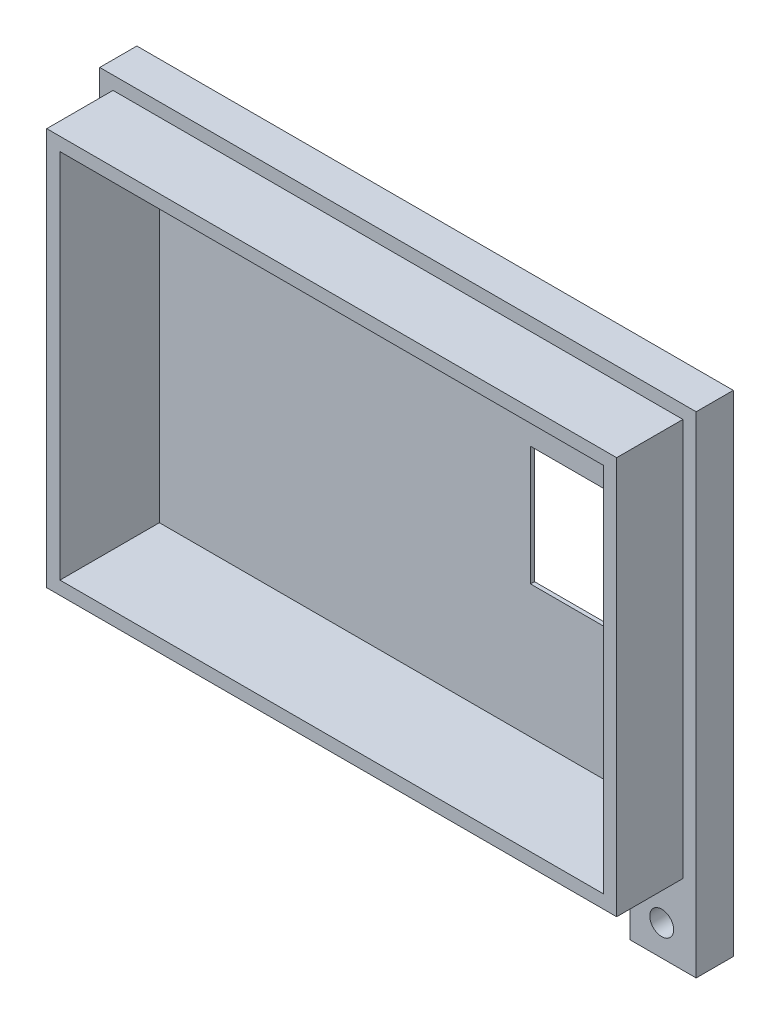
ISO-10303-21;
HEADER;
FILE_DESCRIPTION(('STEP AP214'),'2;1');
FILE_NAME('part.step','',(''),(''),'','','');
FILE_SCHEMA(('AUTOMOTIVE_DESIGN { 1 0 10303 214 1 1 1 1 }'));
ENDSEC;
DATA;
#1=APPLICATION_CONTEXT('core data for automotive mechanical design processes');
#2=APPLICATION_PROTOCOL_DEFINITION('international standard','automotive_design',2000,#1);
#3=PRODUCT_CONTEXT('',#1,'mechanical');
#4=PRODUCT('Part','Part','',(#3));
#5=PRODUCT_RELATED_PRODUCT_CATEGORY('part','',(#4));
#6=PRODUCT_DEFINITION_FORMATION('','',#4);
#7=PRODUCT_DEFINITION_CONTEXT('part definition',#1,'design');
#8=PRODUCT_DEFINITION('design','',#6,#7);
#9=PRODUCT_DEFINITION_SHAPE('','',#8);
#10=(LENGTH_UNIT() NAMED_UNIT(*) SI_UNIT(.MILLI.,.METRE.));
#11=(NAMED_UNIT(*) PLANE_ANGLE_UNIT() SI_UNIT($,.RADIAN.));
#12=(NAMED_UNIT(*) SI_UNIT($,.STERADIAN.) SOLID_ANGLE_UNIT());
#13=UNCERTAINTY_MEASURE_WITH_UNIT(LENGTH_MEASURE(1.E-05),#10,'distance_accuracy_value','');
#14=(GEOMETRIC_REPRESENTATION_CONTEXT(3) GLOBAL_UNCERTAINTY_ASSIGNED_CONTEXT((#13)) GLOBAL_UNIT_ASSIGNED_CONTEXT((#10,
#11,#12)) REPRESENTATION_CONTEXT('',''));
#15=CARTESIAN_POINT('',(0.,0.,0.));
#16=DIRECTION('',(0.,0.,1.));
#17=DIRECTION('',(1.,0.,0.));
#18=AXIS2_PLACEMENT_3D('',#15,#16,#17);
#19=CARTESIAN_POINT('',(-15.0756208599428,-20.0832626800544,7.8));
#20=DIRECTION('',(0.,1.,0.));
#21=DIRECTION('',(0.,0.,1.));
#22=AXIS2_PLACEMENT_3D('',#19,#20,#21);
#23=PLANE('',#22);
#24=DIRECTION('',(0.,0.,-1.));
#25=VECTOR('',#24,1.);
#26=CARTESIAN_POINT('',(24.9243791400572,-20.0832626800544,9.87106781186548));
#27=LINE('',#26,#25);
#28=CARTESIAN_POINT('',(24.9243791400572,-20.0832626800544,2.8));
#29=VERTEX_POINT('',#28);
#30=CARTESIAN_POINT('',(24.9243791400572,-20.0832626800544,0.));
#31=VERTEX_POINT('',#30);
#32=EDGE_CURVE('E55',#29,#31,#27,.T.);
#33=ORIENTED_EDGE('',*,*,#32,.F.);
#34=DIRECTION('',(1.,0.,0.));
#35=VECTOR('',#34,1.);
#36=CARTESIAN_POINT('',(-15.0756208599428,-20.0832626800544,2.8));
#37=LINE('',#36,#35);
#38=CARTESIAN_POINT('',(-15.0756208599428,-20.0832626800544,2.8));
#39=VERTEX_POINT('',#38);
#40=EDGE_CURVE('E171',#39,#29,#37,.T.);
#41=ORIENTED_EDGE('',*,*,#40,.F.);
#42=DIRECTION('',(0.,0.,-1.));
#43=VECTOR('',#42,1.);
#44=CARTESIAN_POINT('',(-15.0756208599428,-20.0832626800544,7.8));
#45=LINE('',#44,#43);
#46=CARTESIAN_POINT('',(-15.0756208599428,-20.0832626800544,0.));
#47=VERTEX_POINT('',#46);
#48=EDGE_CURVE('E48',#39,#47,#45,.T.);
#49=ORIENTED_EDGE('',*,*,#48,.T.);
#50=DIRECTION('',(1.,0.,0.));
#51=VECTOR('',#50,1.);
#52=CARTESIAN_POINT('',(-15.0756208599428,-20.0832626800544,0.));
#53=LINE('',#52,#51);
#54=EDGE_CURVE('E292',#47,#31,#53,.T.);
#55=ORIENTED_EDGE('',*,*,#54,.T.);
#56=EDGE_LOOP('',(#33,#41,#49,#55));
#57=FACE_BOUND('',#56,.T.);
#58=ADVANCED_FACE('F39',(#57),#23,.F.);
#59=CARTESIAN_POINT('',(0.,0.,7.8));
#60=DIRECTION('',(0.,0.,1.));
#61=DIRECTION('',(1.,0.,0.));
#62=AXIS2_PLACEMENT_3D('',#59,#60,#61);
#63=PLANE('',#62);
#64=DIRECTION('',(-1.,0.,0.));
#65=VECTOR('',#64,1.);
#66=CARTESIAN_POINT('',(27.9243791400572,9.91673731994565,7.8));
#67=LINE('',#66,#65);
#68=CARTESIAN_POINT('',(27.9243791400572,9.91673731994565,7.8));
#69=VERTEX_POINT('',#68);
#70=CARTESIAN_POINT('',(-13.0756208599428,9.91673731994565,7.8));
#71=VERTEX_POINT('',#70);
#72=EDGE_CURVE('E257',#69,#71,#67,.T.);
#73=ORIENTED_EDGE('',*,*,#72,.F.);
#74=DIRECTION('',(0.,1.,0.));
#75=VECTOR('',#74,1.);
#76=CARTESIAN_POINT('',(27.9243791400572,-18.0832626800544,7.8));
#77=LINE('',#76,#75);
#78=CARTESIAN_POINT('',(27.9243791400572,-18.0832626800544,7.8));
#79=VERTEX_POINT('',#78);
#80=EDGE_CURVE('E262',#79,#69,#77,.T.);
#81=ORIENTED_EDGE('',*,*,#80,.F.);
#82=DIRECTION('',(1.,0.,0.));
#83=VECTOR('',#82,1.);
#84=CARTESIAN_POINT('',(-13.0756208599428,-18.0832626800544,7.8));
#85=LINE('',#84,#83);
#86=CARTESIAN_POINT('',(-13.0756208599428,-18.0832626800544,7.8));
#87=VERTEX_POINT('',#86);
#88=EDGE_CURVE('E276',#87,#79,#85,.T.);
#89=ORIENTED_EDGE('',*,*,#88,.F.);
#90=DIRECTION('',(0.,-1.,0.));
#91=VECTOR('',#90,1.);
#92=CARTESIAN_POINT('',(-13.0756208599428,9.91673731994565,7.8));
#93=LINE('',#92,#91);
#94=EDGE_CURVE('E273',#71,#87,#93,.T.);
#95=ORIENTED_EDGE('',*,*,#94,.F.);
#96=EDGE_LOOP('',(#73,#81,#89,#95));
#97=FACE_BOUND('',#96,.T.);
#98=DIRECTION('',(0.,1.,0.));
#99=VECTOR('',#98,1.);
#100=CARTESIAN_POINT('',(28.9243791400572,-19.0832626800544,7.8));
#101=LINE('',#100,#99);
#102=CARTESIAN_POINT('',(28.9243791400572,-19.0832626800544,7.8));
#103=VERTEX_POINT('',#102);
#104=CARTESIAN_POINT('',(28.9243791400572,10.9167373199456,7.8));
#105=VERTEX_POINT('',#104);
#106=EDGE_CURVE('E224',#103,#105,#101,.T.);
#107=ORIENTED_EDGE('',*,*,#106,.T.);
#108=DIRECTION('',(-1.,0.,0.));
#109=VECTOR('',#108,1.);
#110=CARTESIAN_POINT('',(28.9243791400572,10.9167373199456,7.8));
#111=LINE('',#110,#109);
#112=CARTESIAN_POINT('',(-14.0756208599428,10.9167373199456,7.8));
#113=VERTEX_POINT('',#112);
#114=EDGE_CURVE('E219',#105,#113,#111,.T.);
#115=ORIENTED_EDGE('',*,*,#114,.T.);
#116=DIRECTION('',(0.,-1.,0.));
#117=VECTOR('',#116,1.);
#118=CARTESIAN_POINT('',(-14.0756208599428,10.9167373199456,7.8));
#119=LINE('',#118,#117);
#120=CARTESIAN_POINT('',(-14.0756208599428,-19.0832626800544,7.8));
#121=VERTEX_POINT('',#120);
#122=EDGE_CURVE('E236',#113,#121,#119,.T.);
#123=ORIENTED_EDGE('',*,*,#122,.T.);
#124=DIRECTION('',(1.,0.,0.));
#125=VECTOR('',#124,1.);
#126=CARTESIAN_POINT('',(-14.0756208599428,-19.0832626800544,7.8));
#127=LINE('',#126,#125);
#128=EDGE_CURVE('E239',#121,#103,#127,.T.);
#129=ORIENTED_EDGE('',*,*,#128,.T.);
#130=EDGE_LOOP('',(#107,#115,#123,#129));
#131=FACE_BOUND('',#130,.T.);
#132=ADVANCED_FACE('F374',(#97,#131),#63,.T.);
#133=CARTESIAN_POINT('',(27.9243791400572,9.91673731994565,0.3));
#134=DIRECTION('',(0.,1.,0.));
#135=DIRECTION('',(0.,0.,1.));
#136=AXIS2_PLACEMENT_3D('',#133,#134,#135);
#137=PLANE('',#136);
#138=ORIENTED_EDGE('',*,*,#72,.T.);
#139=DIRECTION('',(0.,0.,1.));
#140=VECTOR('',#139,1.);
#141=CARTESIAN_POINT('',(-13.0756208599428,9.91673731994565,0.3));
#142=LINE('',#141,#140);
#143=CARTESIAN_POINT('',(-13.0756208599428,9.91673731994565,0.3));
#144=VERTEX_POINT('',#143);
#145=EDGE_CURVE('E271',#144,#71,#142,.T.);
#146=ORIENTED_EDGE('',*,*,#145,.F.);
#147=DIRECTION('',(-1.,0.,0.));
#148=VECTOR('',#147,1.);
#149=CARTESIAN_POINT('',(27.9243791400572,9.91673731994565,0.3));
#150=LINE('',#149,#148);
#151=CARTESIAN_POINT('',(27.9243791400572,9.91673731994565,0.3));
#152=VERTEX_POINT('',#151);
#153=EDGE_CURVE('E258',#152,#144,#150,.T.);
#154=ORIENTED_EDGE('',*,*,#153,.F.);
#155=DIRECTION('',(0.,0.,1.));
#156=VECTOR('',#155,1.);
#157=CARTESIAN_POINT('',(27.9243791400572,9.91673731994565,0.3));
#158=LINE('',#157,#156);
#159=EDGE_CURVE('E281',#152,#69,#158,.T.);
#160=ORIENTED_EDGE('',*,*,#159,.T.);
#161=EDGE_LOOP('',(#138,#146,#154,#160));
#162=FACE_BOUND('',#161,.T.);
#163=ADVANCED_FACE('F379',(#162),#137,.F.);
#164=CARTESIAN_POINT('',(27.9243791400572,-18.0832626800544,0.3));
#165=DIRECTION('',(1.,0.,0.));
#166=DIRECTION('',(0.,1.,0.));
#167=AXIS2_PLACEMENT_3D('',#164,#165,#166);
#168=PLANE('',#167);
#169=ORIENTED_EDGE('',*,*,#80,.T.);
#170=ORIENTED_EDGE('',*,*,#159,.F.);
#171=DIRECTION('',(0.,1.,0.));
#172=VECTOR('',#171,1.);
#173=CARTESIAN_POINT('',(27.9243791400572,-18.0832626800544,0.3));
#174=LINE('',#173,#172);
#175=CARTESIAN_POINT('',(27.9243791400572,-18.0832626800544,0.3));
#176=VERTEX_POINT('',#175);
#177=EDGE_CURVE('E268',#176,#152,#174,.T.);
#178=ORIENTED_EDGE('',*,*,#177,.F.);
#179=DIRECTION('',(0.,0.,1.));
#180=VECTOR('',#179,1.);
#181=CARTESIAN_POINT('',(27.9243791400572,-18.0832626800544,0.3));
#182=LINE('',#181,#180);
#183=EDGE_CURVE('E284',#176,#79,#182,.T.);
#184=ORIENTED_EDGE('',*,*,#183,.T.);
#185=EDGE_LOOP('',(#169,#170,#178,#184));
#186=FACE_BOUND('',#185,.T.);
#187=ADVANCED_FACE('F388',(#186),#168,.F.);
#188=CARTESIAN_POINT('',(-13.0756208599428,-18.0832626800544,0.3));
#189=DIRECTION('',(0.,-1.,0.));
#190=DIRECTION('',(0.,0.,-1.));
#191=AXIS2_PLACEMENT_3D('',#188,#189,#190);
#192=PLANE('',#191);
#193=ORIENTED_EDGE('',*,*,#88,.T.);
#194=ORIENTED_EDGE('',*,*,#183,.F.);
#195=DIRECTION('',(1.,0.,0.));
#196=VECTOR('',#195,1.);
#197=CARTESIAN_POINT('',(-13.0756208599428,-18.0832626800544,0.3));
#198=LINE('',#197,#196);
#199=CARTESIAN_POINT('',(-13.0756208599428,-18.0832626800544,0.3));
#200=VERTEX_POINT('',#199);
#201=EDGE_CURVE('E265',#200,#176,#198,.T.);
#202=ORIENTED_EDGE('',*,*,#201,.F.);
#203=DIRECTION('',(0.,0.,1.));
#204=VECTOR('',#203,1.);
#205=CARTESIAN_POINT('',(-13.0756208599428,-18.0832626800544,0.3));
#206=LINE('',#205,#204);
#207=EDGE_CURVE('E286',#200,#87,#206,.T.);
#208=ORIENTED_EDGE('',*,*,#207,.T.);
#209=EDGE_LOOP('',(#193,#194,#202,#208));
#210=FACE_BOUND('',#209,.T.);
#211=ADVANCED_FACE('F393',(#210),#192,.F.);
#212=CARTESIAN_POINT('',(-13.0756208599428,9.91673731994565,0.3));
#213=DIRECTION('',(-1.,0.,0.));
#214=DIRECTION('',(0.,-1.,0.));
#215=AXIS2_PLACEMENT_3D('',#212,#213,#214);
#216=PLANE('',#215);
#217=ORIENTED_EDGE('',*,*,#94,.T.);
#218=ORIENTED_EDGE('',*,*,#207,.F.);
#219=DIRECTION('',(0.,-1.,0.));
#220=VECTOR('',#219,1.);
#221=CARTESIAN_POINT('',(-13.0756208599428,9.91673731994565,0.3));
#222=LINE('',#221,#220);
#223=EDGE_CURVE('E261',#144,#200,#222,.T.);
#224=ORIENTED_EDGE('',*,*,#223,.F.);
#225=ORIENTED_EDGE('',*,*,#145,.T.);
#226=EDGE_LOOP('',(#217,#218,#224,#225));
#227=FACE_BOUND('',#226,.T.);
#228=ADVANCED_FACE('F390',(#227),#216,.F.);
#229=CARTESIAN_POINT('',(0.,0.,0.3));
#230=DIRECTION('',(0.,0.,1.));
#231=DIRECTION('',(1.,0.,0.));
#232=AXIS2_PLACEMENT_3D('',#229,#230,#231);
#233=PLANE('',#232);
#234=DIRECTION('',(0.,1.,0.));
#235=VECTOR('',#234,1.);
#236=CARTESIAN_POINT('',(23.9243791400572,0.,0.3));
#237=LINE('',#236,#235);
#238=CARTESIAN_POINT('',(23.9243791400572,-8.08326268005435,0.3));
#239=VERTEX_POINT('',#238);
#240=CARTESIAN_POINT('',(23.9243791400572,0.916737319945649,0.3));
#241=VERTEX_POINT('',#240);
#242=EDGE_CURVE('E217',#239,#241,#237,.T.);
#243=ORIENTED_EDGE('',*,*,#242,.F.);
#244=DIRECTION('',(1.,0.,0.));
#245=VECTOR('',#244,1.);
#246=CARTESIAN_POINT('',(0.,-8.08326268005435,0.3));
#247=LINE('',#246,#245);
#248=CARTESIAN_POINT('',(14.9243791400572,-8.08326268005435,0.3));
#249=VERTEX_POINT('',#248);
#250=EDGE_CURVE('E206',#249,#239,#247,.T.);
#251=ORIENTED_EDGE('',*,*,#250,.F.);
#252=DIRECTION('',(0.,-1.,0.));
#253=VECTOR('',#252,1.);
#254=CARTESIAN_POINT('',(14.9243791400572,0.,0.3));
#255=LINE('',#254,#253);
#256=CARTESIAN_POINT('',(14.9243791400572,0.916737319945649,0.3));
#257=VERTEX_POINT('',#256);
#258=EDGE_CURVE('E213',#257,#249,#255,.T.);
#259=ORIENTED_EDGE('',*,*,#258,.F.);
#260=DIRECTION('',(-1.,0.,0.));
#261=VECTOR('',#260,1.);
#262=CARTESIAN_POINT('',(0.,0.916737319945649,0.3));
#263=LINE('',#262,#261);
#264=EDGE_CURVE('E215',#241,#257,#263,.T.);
#265=ORIENTED_EDGE('',*,*,#264,.F.);
#266=EDGE_LOOP('',(#243,#251,#259,#265));
#267=FACE_BOUND('',#266,.T.);
#268=ORIENTED_EDGE('',*,*,#153,.T.);
#269=ORIENTED_EDGE('',*,*,#223,.T.);
#270=ORIENTED_EDGE('',*,*,#201,.T.);
#271=ORIENTED_EDGE('',*,*,#177,.T.);
#272=EDGE_LOOP('',(#268,#269,#270,#271));
#273=FACE_BOUND('',#272,.T.);
#274=ADVANCED_FACE('F357',(#267,#273),#233,.T.);
#275=CARTESIAN_POINT('',(7.42437914005721,-4.08326268005435,2.8));
#276=DIRECTION('',(0.,0.,1.));
#277=DIRECTION('',(1.,0.,0.));
#278=AXIS2_PLACEMENT_3D('',#275,#276,#277);
#279=PLANE('',#278);
#280=CARTESIAN_POINT('',(27.3249585587116,-22.7832626800544,2.8));
#281=DIRECTION('',(0.,0.,1.));
#282=DIRECTION('',(1.,0.,0.));
#283=AXIS2_PLACEMENT_3D('',#280,#281,#282);
#284=CIRCLE('',#283,0.899999999999998);
#285=CARTESIAN_POINT('',(28.2249585587116,-22.7832626800544,2.8));
#286=VERTEX_POINT('',#285);
#287=EDGE_CURVE('E43',#286,#286,#284,.T.);
#288=ORIENTED_EDGE('',*,*,#287,.F.);
#289=EDGE_LOOP('',(#288));
#290=FACE_BOUND('',#289,.T.);
#291=DIRECTION('',(0.,1.,0.));
#292=VECTOR('',#291,1.);
#293=CARTESIAN_POINT('',(28.9243791400572,-19.0832626800544,2.8));
#294=LINE('',#293,#292);
#295=CARTESIAN_POINT('',(28.9243791400572,-19.0832626800544,2.8));
#296=VERTEX_POINT('',#295);
#297=CARTESIAN_POINT('',(28.9243791400572,10.9167373199456,2.8));
#298=VERTEX_POINT('',#297);
#299=EDGE_CURVE('E230',#296,#298,#294,.T.);
#300=ORIENTED_EDGE('',*,*,#299,.F.);
#301=DIRECTION('',(1.,0.,0.));
#302=VECTOR('',#301,1.);
#303=CARTESIAN_POINT('',(-14.0756208599428,-19.0832626800544,2.8));
#304=LINE('',#303,#302);
#305=CARTESIAN_POINT('',(-14.0756208599428,-19.0832626800544,2.8));
#306=VERTEX_POINT('',#305);
#307=EDGE_CURVE('E227',#306,#296,#304,.T.);
#308=ORIENTED_EDGE('',*,*,#307,.F.);
#309=DIRECTION('',(0.,-1.,0.));
#310=VECTOR('',#309,1.);
#311=CARTESIAN_POINT('',(-14.0756208599428,10.9167373199456,2.8));
#312=LINE('',#311,#310);
#313=CARTESIAN_POINT('',(-14.0756208599428,10.9167373199456,2.8));
#314=VERTEX_POINT('',#313);
#315=EDGE_CURVE('E223',#314,#306,#312,.T.);
#316=ORIENTED_EDGE('',*,*,#315,.F.);
#317=DIRECTION('',(-1.,0.,0.));
#318=VECTOR('',#317,1.);
#319=CARTESIAN_POINT('',(28.9243791400572,10.9167373199456,2.8));
#320=LINE('',#319,#318);
#321=EDGE_CURVE('E220',#298,#314,#320,.T.);
#322=ORIENTED_EDGE('',*,*,#321,.F.);
#323=EDGE_LOOP('',(#300,#308,#316,#322));
#324=FACE_BOUND('',#323,.T.);
#325=DIRECTION('',(0.,-1.,0.));
#326=VECTOR('',#325,1.);
#327=CARTESIAN_POINT('',(-15.0756208599428,11.9167373199456,2.8));
#328=LINE('',#327,#326);
#329=CARTESIAN_POINT('',(-15.0756208599428,11.9167373199456,2.8));
#330=VERTEX_POINT('',#329);
#331=EDGE_CURVE('E255',#330,#39,#328,.T.);
#332=ORIENTED_EDGE('',*,*,#331,.T.);
#333=ORIENTED_EDGE('',*,*,#40,.T.);
#334=DIRECTION('',(0.,1.,0.));
#335=VECTOR('',#334,1.);
#336=CARTESIAN_POINT('',(24.9243791400572,-20.0832626800544,2.8));
#337=LINE('',#336,#335);
#338=CARTESIAN_POINT('',(24.9243791400572,-25.0832626800544,2.8));
#339=VERTEX_POINT('',#338);
#340=EDGE_CURVE('E165',#339,#29,#337,.T.);
#341=ORIENTED_EDGE('',*,*,#340,.F.);
#342=DIRECTION('',(-1.,0.,0.));
#343=VECTOR('',#342,1.);
#344=CARTESIAN_POINT('',(29.9243791400572,-25.0832626800544,2.8));
#345=LINE('',#344,#343);
#346=CARTESIAN_POINT('',(29.9243791400572,-25.0832626800544,2.8));
#347=VERTEX_POINT('',#346);
#348=EDGE_CURVE('E169',#347,#339,#345,.T.);
#349=ORIENTED_EDGE('',*,*,#348,.F.);
#350=DIRECTION('',(0.,1.,0.));
#351=VECTOR('',#350,1.);
#352=CARTESIAN_POINT('',(29.9243791400572,11.9167373199456,2.8));
#353=LINE('',#352,#351);
#354=CARTESIAN_POINT('',(29.9243791400572,11.9167373199456,2.8));
#355=VERTEX_POINT('',#354);
#356=EDGE_CURVE('E246',#347,#355,#353,.T.);
#357=ORIENTED_EDGE('',*,*,#356,.T.);
#358=DIRECTION('',(-1.,0.,0.));
#359=VECTOR('',#358,1.);
#360=CARTESIAN_POINT('',(-15.0756208599428,11.9167373199456,2.8));
#361=LINE('',#360,#359);
#362=EDGE_CURVE('E12',#355,#330,#361,.T.);
#363=ORIENTED_EDGE('',*,*,#362,.T.);
#364=EDGE_LOOP('',(#332,#333,#341,#349,#357,#363));
#365=FACE_BOUND('',#364,.T.);
#366=ADVANCED_FACE('F167',(#290,#324,#365),#279,.T.);
#367=CARTESIAN_POINT('',(28.9243791400572,10.9167373199456,2.8));
#368=DIRECTION('',(0.,1.,0.));
#369=DIRECTION('',(0.,0.,1.));
#370=AXIS2_PLACEMENT_3D('',#367,#368,#369);
#371=PLANE('',#370);
#372=ORIENTED_EDGE('',*,*,#114,.F.);
#373=DIRECTION('',(0.,0.,1.));
#374=VECTOR('',#373,1.);
#375=CARTESIAN_POINT('',(28.9243791400572,10.9167373199456,2.8));
#376=LINE('',#375,#374);
#377=EDGE_CURVE('E244',#298,#105,#376,.T.);
#378=ORIENTED_EDGE('',*,*,#377,.F.);
#379=ORIENTED_EDGE('',*,*,#321,.T.);
#380=DIRECTION('',(0.,0.,1.));
#381=VECTOR('',#380,1.);
#382=CARTESIAN_POINT('',(-14.0756208599428,10.9167373199456,2.8));
#383=LINE('',#382,#381);
#384=EDGE_CURVE('E233',#314,#113,#383,.T.);
#385=ORIENTED_EDGE('',*,*,#384,.T.);
#386=EDGE_LOOP('',(#372,#378,#379,#385));
#387=FACE_BOUND('',#386,.T.);
#388=ADVANCED_FACE('F405',(#387),#371,.T.);
#389=CARTESIAN_POINT('',(28.9243791400572,-19.0832626800544,2.8));
#390=DIRECTION('',(1.,0.,0.));
#391=DIRECTION('',(0.,1.,0.));
#392=AXIS2_PLACEMENT_3D('',#389,#390,#391);
#393=PLANE('',#392);
#394=ORIENTED_EDGE('',*,*,#106,.F.);
#395=DIRECTION('',(0.,0.,1.));
#396=VECTOR('',#395,1.);
#397=CARTESIAN_POINT('',(28.9243791400572,-19.0832626800544,2.8));
#398=LINE('',#397,#396);
#399=EDGE_CURVE('E247',#296,#103,#398,.T.);
#400=ORIENTED_EDGE('',*,*,#399,.F.);
#401=ORIENTED_EDGE('',*,*,#299,.T.);
#402=ORIENTED_EDGE('',*,*,#377,.T.);
#403=EDGE_LOOP('',(#394,#400,#401,#402));
#404=FACE_BOUND('',#403,.T.);
#405=ADVANCED_FACE('F409',(#404),#393,.T.);
#406=CARTESIAN_POINT('',(-14.0756208599428,-19.0832626800544,2.8));
#407=DIRECTION('',(0.,-1.,0.));
#408=DIRECTION('',(0.,0.,-1.));
#409=AXIS2_PLACEMENT_3D('',#406,#407,#408);
#410=PLANE('',#409);
#411=ORIENTED_EDGE('',*,*,#128,.F.);
#412=DIRECTION('',(0.,0.,1.));
#413=VECTOR('',#412,1.);
#414=CARTESIAN_POINT('',(-14.0756208599428,-19.0832626800544,2.8));
#415=LINE('',#414,#413);
#416=EDGE_CURVE('E249',#306,#121,#415,.T.);
#417=ORIENTED_EDGE('',*,*,#416,.F.);
#418=ORIENTED_EDGE('',*,*,#307,.T.);
#419=ORIENTED_EDGE('',*,*,#399,.T.);
#420=EDGE_LOOP('',(#411,#417,#418,#419));
#421=FACE_BOUND('',#420,.T.);
#422=ADVANCED_FACE('F413',(#421),#410,.T.);
#423=CARTESIAN_POINT('',(-14.0756208599428,10.9167373199456,2.8));
#424=DIRECTION('',(-1.,0.,0.));
#425=DIRECTION('',(0.,-1.,0.));
#426=AXIS2_PLACEMENT_3D('',#423,#424,#425);
#427=PLANE('',#426);
#428=ORIENTED_EDGE('',*,*,#122,.F.);
#429=ORIENTED_EDGE('',*,*,#384,.F.);
#430=ORIENTED_EDGE('',*,*,#315,.T.);
#431=ORIENTED_EDGE('',*,*,#416,.T.);
#432=EDGE_LOOP('',(#428,#429,#430,#431));
#433=FACE_BOUND('',#432,.T.);
#434=ADVANCED_FACE('F342',(#433),#427,.T.);
#435=CARTESIAN_POINT('',(0.,0.,0.));
#436=DIRECTION('',(0.,0.,1.));
#437=DIRECTION('',(1.,0.,0.));
#438=AXIS2_PLACEMENT_3D('',#435,#436,#437);
#439=PLANE('',#438);
#440=CARTESIAN_POINT('',(27.3249585587116,-22.7832626800544,0.));
#441=DIRECTION('',(0.,0.,-1.));
#442=DIRECTION('',(-1.,0.,0.));
#443=AXIS2_PLACEMENT_3D('',#440,#441,#442);
#444=CIRCLE('',#443,1.775);
#445=CARTESIAN_POINT('',(25.5499585587116,-22.7832626800544,0.));
#446=VERTEX_POINT('',#445);
#447=EDGE_CURVE('E334',#446,#446,#444,.T.);
#448=ORIENTED_EDGE('',*,*,#447,.F.);
#449=EDGE_LOOP('',(#448));
#450=FACE_BOUND('',#449,.T.);
#451=DIRECTION('',(-1.,0.,0.));
#452=VECTOR('',#451,1.);
#453=CARTESIAN_POINT('',(23.9243791400572,-8.08326268005435,0.));
#454=LINE('',#453,#452);
#455=CARTESIAN_POINT('',(23.9243791400572,-8.08326268005435,0.));
#456=VERTEX_POINT('',#455);
#457=CARTESIAN_POINT('',(14.9243791400572,-8.08326268005435,0.));
#458=VERTEX_POINT('',#457);
#459=EDGE_CURVE('E195',#456,#458,#454,.T.);
#460=ORIENTED_EDGE('',*,*,#459,.F.);
#461=DIRECTION('',(0.,-1.,0.));
#462=VECTOR('',#461,1.);
#463=CARTESIAN_POINT('',(23.9243791400572,0.916737319945649,0.));
#464=LINE('',#463,#462);
#465=CARTESIAN_POINT('',(23.9243791400572,0.916737319945649,0.));
#466=VERTEX_POINT('',#465);
#467=EDGE_CURVE('E193',#466,#456,#464,.T.);
#468=ORIENTED_EDGE('',*,*,#467,.F.);
#469=DIRECTION('',(1.,0.,0.));
#470=VECTOR('',#469,1.);
#471=CARTESIAN_POINT('',(23.9243791400572,0.916737319945649,0.));
#472=LINE('',#471,#470);
#473=CARTESIAN_POINT('',(14.9243791400572,0.916737319945649,0.));
#474=VERTEX_POINT('',#473);
#475=EDGE_CURVE('E200',#474,#466,#472,.T.);
#476=ORIENTED_EDGE('',*,*,#475,.F.);
#477=DIRECTION('',(0.,1.,0.));
#478=VECTOR('',#477,1.);
#479=CARTESIAN_POINT('',(14.9243791400572,0.916737319945649,0.));
#480=LINE('',#479,#478);
#481=EDGE_CURVE('E197',#458,#474,#480,.T.);
#482=ORIENTED_EDGE('',*,*,#481,.F.);
#483=EDGE_LOOP('',(#460,#468,#476,#482));
#484=FACE_BOUND('',#483,.T.);
#485=DIRECTION('',(0.,-1.,0.));
#486=VECTOR('',#485,1.);
#487=CARTESIAN_POINT('',(-15.0756208599428,11.9167373199456,0.));
#488=LINE('',#487,#486);
#489=CARTESIAN_POINT('',(-15.0756208599428,11.9167373199456,0.));
#490=VERTEX_POINT('',#489);
#491=EDGE_CURVE('E283',#490,#47,#488,.T.);
#492=ORIENTED_EDGE('',*,*,#491,.F.);
#493=DIRECTION('',(-1.,0.,0.));
#494=VECTOR('',#493,1.);
#495=CARTESIAN_POINT('',(-15.0756208599428,11.9167373199456,0.));
#496=LINE('',#495,#494);
#497=CARTESIAN_POINT('',(29.9243791400572,11.9167373199456,0.));
#498=VERTEX_POINT('',#497);
#499=EDGE_CURVE('E297',#498,#490,#496,.T.);
#500=ORIENTED_EDGE('',*,*,#499,.F.);
#501=DIRECTION('',(0.,1.,0.));
#502=VECTOR('',#501,1.);
#503=CARTESIAN_POINT('',(29.9243791400572,11.9167373199456,0.));
#504=LINE('',#503,#502);
#505=CARTESIAN_POINT('',(29.9243791400572,-25.0832626800544,0.));
#506=VERTEX_POINT('',#505);
#507=EDGE_CURVE('E294',#506,#498,#504,.T.);
#508=ORIENTED_EDGE('',*,*,#507,.F.);
#509=DIRECTION('',(-1.,0.,0.));
#510=VECTOR('',#509,1.);
#511=CARTESIAN_POINT('',(29.9243791400572,-25.0832626800544,0.));
#512=LINE('',#511,#510);
#513=CARTESIAN_POINT('',(24.9243791400572,-25.0832626800544,0.));
#514=VERTEX_POINT('',#513);
#515=EDGE_CURVE('E187',#506,#514,#512,.T.);
#516=ORIENTED_EDGE('',*,*,#515,.T.);
#517=DIRECTION('',(0.,1.,0.));
#518=VECTOR('',#517,1.);
#519=CARTESIAN_POINT('',(24.9243791400572,-20.0832626800544,0.));
#520=LINE('',#519,#518);
#521=EDGE_CURVE('E178',#514,#31,#520,.T.);
#522=ORIENTED_EDGE('',*,*,#521,.T.);
#523=ORIENTED_EDGE('',*,*,#54,.F.);
#524=EDGE_LOOP('',(#492,#500,#508,#516,#522,#523));
#525=FACE_BOUND('',#524,.T.);
#526=ADVANCED_FACE('F310',(#450,#484,#525),#439,.F.);
#527=CARTESIAN_POINT('',(-15.0756208599428,11.9167373199456,7.8));
#528=DIRECTION('',(0.,-1.,0.));
#529=DIRECTION('',(0.,0.,-1.));
#530=AXIS2_PLACEMENT_3D('',#527,#528,#529);
#531=PLANE('',#530);
#532=ORIENTED_EDGE('',*,*,#362,.F.);
#533=DIRECTION('',(0.,0.,-1.));
#534=VECTOR('',#533,1.);
#535=CARTESIAN_POINT('',(29.9243791400572,11.9167373199456,7.8));
#536=LINE('',#535,#534);
#537=EDGE_CURVE('E302',#355,#498,#536,.T.);
#538=ORIENTED_EDGE('',*,*,#537,.T.);
#539=ORIENTED_EDGE('',*,*,#499,.T.);
#540=DIRECTION('',(0.,0.,-1.));
#541=VECTOR('',#540,1.);
#542=CARTESIAN_POINT('',(-15.0756208599428,11.9167373199456,7.8));
#543=LINE('',#542,#541);
#544=EDGE_CURVE('E300',#330,#490,#543,.T.);
#545=ORIENTED_EDGE('',*,*,#544,.F.);
#546=EDGE_LOOP('',(#532,#538,#539,#545));
#547=FACE_BOUND('',#546,.T.);
#548=ADVANCED_FACE('F315',(#547),#531,.F.);
#549=CARTESIAN_POINT('',(29.9243791400572,11.9167373199456,7.8));
#550=DIRECTION('',(-1.,0.,0.));
#551=DIRECTION('',(0.,-1.,0.));
#552=AXIS2_PLACEMENT_3D('',#549,#550,#551);
#553=PLANE('',#552);
#554=ORIENTED_EDGE('',*,*,#356,.F.);
#555=DIRECTION('',(0.,0.,-1.));
#556=VECTOR('',#555,1.);
#557=CARTESIAN_POINT('',(29.9243791400572,-25.0832626800544,9.87106781186548));
#558=LINE('',#557,#556);
#559=EDGE_CURVE('E185',#347,#506,#558,.T.);
#560=ORIENTED_EDGE('',*,*,#559,.T.);
#561=ORIENTED_EDGE('',*,*,#507,.T.);
#562=ORIENTED_EDGE('',*,*,#537,.F.);
#563=EDGE_LOOP('',(#554,#560,#561,#562));
#564=FACE_BOUND('',#563,.T.);
#565=ADVANCED_FACE('F318',(#564),#553,.F.);
#566=CARTESIAN_POINT('',(-15.0756208599428,11.9167373199456,7.8));
#567=DIRECTION('',(1.,0.,0.));
#568=DIRECTION('',(0.,1.,0.));
#569=AXIS2_PLACEMENT_3D('',#566,#567,#568);
#570=PLANE('',#569);
#571=ORIENTED_EDGE('',*,*,#331,.F.);
#572=ORIENTED_EDGE('',*,*,#544,.T.);
#573=ORIENTED_EDGE('',*,*,#491,.T.);
#574=ORIENTED_EDGE('',*,*,#48,.F.);
#575=EDGE_LOOP('',(#571,#572,#573,#574));
#576=FACE_BOUND('',#575,.T.);
#577=ADVANCED_FACE('F41',(#576),#570,.F.);
#578=CARTESIAN_POINT('',(23.9243791400572,0.916737319945649,5.));
#579=DIRECTION('',(1.,0.,0.));
#580=DIRECTION('',(0.,1.,0.));
#581=AXIS2_PLACEMENT_3D('',#578,#579,#580);
#582=PLANE('',#581);
#583=ORIENTED_EDGE('',*,*,#242,.T.);
#584=DIRECTION('',(0.,0.,-1.));
#585=VECTOR('',#584,1.);
#586=CARTESIAN_POINT('',(23.9243791400572,0.916737319945649,5.));
#587=LINE('',#586,#585);
#588=EDGE_CURVE('E204',#241,#466,#587,.T.);
#589=ORIENTED_EDGE('',*,*,#588,.T.);
#590=ORIENTED_EDGE('',*,*,#467,.T.);
#591=DIRECTION('',(0.,0.,-1.));
#592=VECTOR('',#591,1.);
#593=CARTESIAN_POINT('',(23.9243791400572,-8.08326268005435,5.));
#594=LINE('',#593,#592);
#595=EDGE_CURVE('E203',#239,#456,#594,.T.);
#596=ORIENTED_EDGE('',*,*,#595,.F.);
#597=EDGE_LOOP('',(#583,#589,#590,#596));
#598=FACE_BOUND('',#597,.T.);
#599=ADVANCED_FACE('F353',(#598),#582,.F.);
#600=CARTESIAN_POINT('',(23.9243791400572,0.916737319945649,5.));
#601=DIRECTION('',(0.,1.,0.));
#602=DIRECTION('',(0.,0.,1.));
#603=AXIS2_PLACEMENT_3D('',#600,#601,#602);
#604=PLANE('',#603);
#605=ORIENTED_EDGE('',*,*,#264,.T.);
#606=DIRECTION('',(0.,0.,-1.));
#607=VECTOR('',#606,1.);
#608=CARTESIAN_POINT('',(14.9243791400572,0.916737319945649,5.));
#609=LINE('',#608,#607);
#610=EDGE_CURVE('E207',#257,#474,#609,.T.);
#611=ORIENTED_EDGE('',*,*,#610,.T.);
#612=ORIENTED_EDGE('',*,*,#475,.T.);
#613=ORIENTED_EDGE('',*,*,#588,.F.);
#614=EDGE_LOOP('',(#605,#611,#612,#613));
#615=FACE_BOUND('',#614,.T.);
#616=ADVANCED_FACE('F362',(#615),#604,.F.);
#617=CARTESIAN_POINT('',(14.9243791400572,0.916737319945649,5.));
#618=DIRECTION('',(-1.,0.,0.));
#619=DIRECTION('',(0.,-1.,0.));
#620=AXIS2_PLACEMENT_3D('',#617,#618,#619);
#621=PLANE('',#620);
#622=ORIENTED_EDGE('',*,*,#258,.T.);
#623=DIRECTION('',(0.,0.,-1.));
#624=VECTOR('',#623,1.);
#625=CARTESIAN_POINT('',(14.9243791400572,-8.08326268005435,5.));
#626=LINE('',#625,#624);
#627=EDGE_CURVE('E63',#249,#458,#626,.T.);
#628=ORIENTED_EDGE('',*,*,#627,.T.);
#629=ORIENTED_EDGE('',*,*,#481,.T.);
#630=ORIENTED_EDGE('',*,*,#610,.F.);
#631=EDGE_LOOP('',(#622,#628,#629,#630));
#632=FACE_BOUND('',#631,.T.);
#633=ADVANCED_FACE('F364',(#632),#621,.F.);
#634=CARTESIAN_POINT('',(23.9243791400572,-8.08326268005435,5.));
#635=DIRECTION('',(0.,-1.,0.));
#636=DIRECTION('',(0.,0.,-1.));
#637=AXIS2_PLACEMENT_3D('',#634,#635,#636);
#638=PLANE('',#637);
#639=ORIENTED_EDGE('',*,*,#250,.T.);
#640=ORIENTED_EDGE('',*,*,#595,.T.);
#641=ORIENTED_EDGE('',*,*,#459,.T.);
#642=ORIENTED_EDGE('',*,*,#627,.F.);
#643=EDGE_LOOP('',(#639,#640,#641,#642));
#644=FACE_BOUND('',#643,.T.);
#645=ADVANCED_FACE('F348',(#644),#638,.F.);
#646=CARTESIAN_POINT('',(29.9243791400572,-25.0832626800544,9.87106781186548));
#647=DIRECTION('',(0.,-1.,0.));
#648=DIRECTION('',(0.,0.,-1.));
#649=AXIS2_PLACEMENT_3D('',#646,#647,#648);
#650=PLANE('',#649);
#651=ORIENTED_EDGE('',*,*,#559,.F.);
#652=ORIENTED_EDGE('',*,*,#348,.T.);
#653=DIRECTION('',(0.,0.,-1.));
#654=VECTOR('',#653,1.);
#655=CARTESIAN_POINT('',(24.9243791400572,-25.0832626800544,9.87106781186548));
#656=LINE('',#655,#654);
#657=EDGE_CURVE('E173',#339,#514,#656,.T.);
#658=ORIENTED_EDGE('',*,*,#657,.T.);
#659=ORIENTED_EDGE('',*,*,#515,.F.);
#660=EDGE_LOOP('',(#651,#652,#658,#659));
#661=FACE_BOUND('',#660,.T.);
#662=ADVANCED_FACE('F183',(#661),#650,.T.);
#663=CARTESIAN_POINT('',(24.9243791400572,-20.0832626800544,9.87106781186548));
#664=DIRECTION('',(-1.,0.,0.));
#665=DIRECTION('',(0.,0.,1.));
#666=AXIS2_PLACEMENT_3D('',#663,#664,#665);
#667=PLANE('',#666);
#668=ORIENTED_EDGE('',*,*,#657,.F.);
#669=ORIENTED_EDGE('',*,*,#340,.T.);
#670=ORIENTED_EDGE('',*,*,#32,.T.);
#671=ORIENTED_EDGE('',*,*,#521,.F.);
#672=EDGE_LOOP('',(#668,#669,#670,#671));
#673=FACE_BOUND('',#672,.T.);
#674=ADVANCED_FACE('F176',(#673),#667,.T.);
#675=CARTESIAN_POINT('',(27.3249585587116,-22.7832626800544,0.));
#676=DIRECTION('',(0.,0.,-1.));
#677=DIRECTION('',(-1.,0.,0.));
#678=AXIS2_PLACEMENT_3D('',#675,#676,#677);
#679=CYLINDRICAL_SURFACE('',#678,0.899999999999998);
#680=ORIENTED_EDGE('',*,*,#287,.T.);
#681=EDGE_LOOP('',(#680));
#682=FACE_BOUND('',#681,.T.);
#683=CARTESIAN_POINT('',(27.3249585587116,-22.7832626800544,1.3));
#684=DIRECTION('',(0.,0.,-1.));
#685=DIRECTION('',(-1.,0.,0.));
#686=AXIS2_PLACEMENT_3D('',#683,#684,#685);
#687=CIRCLE('',#686,0.899999999999998);
#688=CARTESIAN_POINT('',(26.4249585587116,-22.7832626800544,1.3));
#689=VERTEX_POINT('',#688);
#690=EDGE_CURVE('E320',#689,#689,#687,.T.);
#691=ORIENTED_EDGE('',*,*,#690,.T.);
#692=EDGE_LOOP('',(#691));
#693=FACE_BOUND('',#692,.T.);
#694=ADVANCED_FACE('F528',(#682,#693),#679,.F.);
#695=CARTESIAN_POINT('',(28.2249585587116,-22.7832626800544,1.3));
#696=DIRECTION('',(0.,0.,1.));
#697=DIRECTION('',(1.,0.,0.));
#698=AXIS2_PLACEMENT_3D('',#695,#696,#697);
#699=PLANE('',#698);
#700=ORIENTED_EDGE('',*,*,#690,.F.);
#701=EDGE_LOOP('',(#700));
#702=FACE_BOUND('',#701,.T.);
#703=CARTESIAN_POINT('',(27.3249585587116,-22.7832626800544,1.3));
#704=DIRECTION('',(0.,0.,-1.));
#705=DIRECTION('',(-1.,0.,0.));
#706=AXIS2_PLACEMENT_3D('',#703,#704,#705);
#707=CIRCLE('',#706,1.75);
#708=CARTESIAN_POINT('',(25.5749585587116,-22.7832626800544,1.3));
#709=VERTEX_POINT('',#708);
#710=EDGE_CURVE('E324',#709,#709,#707,.T.);
#711=ORIENTED_EDGE('',*,*,#710,.T.);
#712=EDGE_LOOP('',(#711));
#713=FACE_BOUND('',#712,.T.);
#714=ADVANCED_FACE('F536',(#702,#713),#699,.F.);
#715=CARTESIAN_POINT('',(27.3249585587116,-22.7832626800544,0.));
#716=DIRECTION('',(0.,0.,-1.));
#717=DIRECTION('',(-1.,0.,0.));
#718=AXIS2_PLACEMENT_3D('',#715,#716,#717);
#719=CYLINDRICAL_SURFACE('',#718,1.75);
#720=ORIENTED_EDGE('',*,*,#710,.F.);
#721=EDGE_LOOP('',(#720));
#722=FACE_BOUND('',#721,.T.);
#723=CARTESIAN_POINT('',(27.3249585587116,-22.7832626800544,0.0250000000000003));
#724=DIRECTION('',(0.,0.,-1.));
#725=DIRECTION('',(-1.,0.,0.));
#726=AXIS2_PLACEMENT_3D('',#723,#724,#725);
#727=CIRCLE('',#726,1.75);
#728=CARTESIAN_POINT('',(25.5749585587116,-22.7832626800544,0.0250000000000003));
#729=VERTEX_POINT('',#728);
#730=EDGE_CURVE('E329',#729,#729,#727,.T.);
#731=ORIENTED_EDGE('',*,*,#730,.T.);
#732=EDGE_LOOP('',(#731));
#733=FACE_BOUND('',#732,.T.);
#734=ADVANCED_FACE('F544',(#722,#733),#719,.F.);
#735=CARTESIAN_POINT('',(27.3249585587116,-22.7832626800544,0.));
#736=DIRECTION('',(0.,0.,-1.));
#737=DIRECTION('',(-1.,0.,0.));
#738=AXIS2_PLACEMENT_3D('',#735,#736,#737);
#739=CONICAL_SURFACE('',#738,1.775,0.785398163397388);
#740=ORIENTED_EDGE('',*,*,#730,.F.);
#741=EDGE_LOOP('',(#740));
#742=FACE_BOUND('',#741,.T.);
#743=ORIENTED_EDGE('',*,*,#447,.T.);
#744=EDGE_LOOP('',(#743));
#745=FACE_BOUND('',#744,.T.);
#746=ADVANCED_FACE('F338',(#742,#745),#739,.F.);
#747=CLOSED_SHELL('',(#58,#132,#163,#187,#211,#228,#274,#366,#388,#405,#422,#434,#526,#548,#565,
#577,#599,#616,#633,#645,#662,#674,#694,#714,#734,#746));
#748=MANIFOLD_SOLID_BREP('B2',#747);
#749=ADVANCED_BREP_SHAPE_REPRESENTATION('',(#18,#748),#14);
#750=SHAPE_DEFINITION_REPRESENTATION(#9,#749);
ENDSEC;
END-ISO-10303-21;
